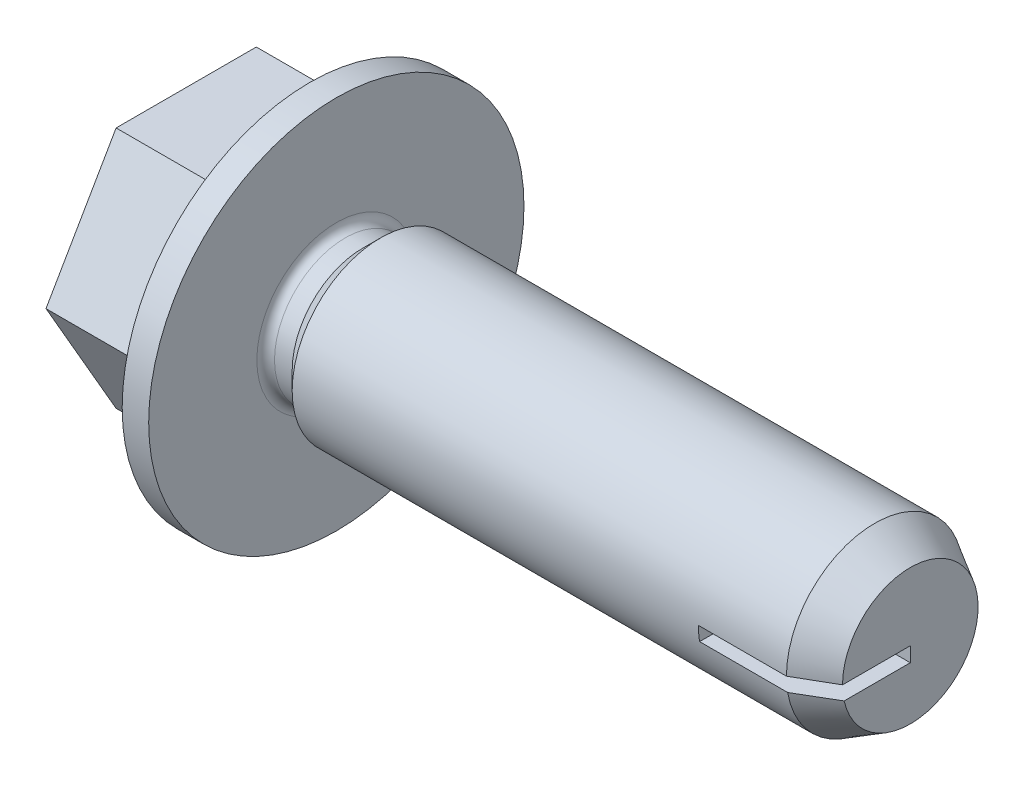
ISO-10303-21;
HEADER;
FILE_DESCRIPTION(('STEP AP214'),'2;1');
FILE_NAME('part.step','',(''),(''),'','','');
FILE_SCHEMA(('AUTOMOTIVE_DESIGN { 1 0 10303 214 1 1 1 1 }'));
ENDSEC;
DATA;
#1=APPLICATION_CONTEXT('core data for automotive mechanical design processes');
#2=APPLICATION_PROTOCOL_DEFINITION('international standard','automotive_design',2000,#1);
#3=PRODUCT_CONTEXT('',#1,'mechanical');
#4=PRODUCT('Part','Part','',(#3));
#5=PRODUCT_RELATED_PRODUCT_CATEGORY('part','',(#4));
#6=PRODUCT_DEFINITION_FORMATION('','',#4);
#7=PRODUCT_DEFINITION_CONTEXT('part definition',#1,'design');
#8=PRODUCT_DEFINITION('design','',#6,#7);
#9=PRODUCT_DEFINITION_SHAPE('','',#8);
#10=(LENGTH_UNIT() NAMED_UNIT(*) SI_UNIT(.MILLI.,.METRE.));
#11=(NAMED_UNIT(*) PLANE_ANGLE_UNIT() SI_UNIT($,.RADIAN.));
#12=(NAMED_UNIT(*) SI_UNIT($,.STERADIAN.) SOLID_ANGLE_UNIT());
#13=UNCERTAINTY_MEASURE_WITH_UNIT(LENGTH_MEASURE(1.E-05),#10,'distance_accuracy_value','');
#14=(GEOMETRIC_REPRESENTATION_CONTEXT(3) GLOBAL_UNCERTAINTY_ASSIGNED_CONTEXT((#13)) GLOBAL_UNIT_ASSIGNED_CONTEXT((#10,
#11,#12)) REPRESENTATION_CONTEXT('',''));
#15=CARTESIAN_POINT('',(0.,0.,0.));
#16=DIRECTION('',(0.,0.,1.));
#17=DIRECTION('',(1.,0.,0.));
#18=AXIS2_PLACEMENT_3D('',#15,#16,#17);
#19=CARTESIAN_POINT('',(-18.5110654105261,11.2461599689433,18.9159068269443));
#20=DIRECTION('',(-1.,0.,0.));
#21=DIRECTION('',(0.,0.,1.));
#22=AXIS2_PLACEMENT_3D('',#19,#20,#21);
#23=CYLINDRICAL_SURFACE('',#22,2.);
#24=CARTESIAN_POINT('',(-17.5110654105261,11.2461599689433,18.9159068269443));
#25=DIRECTION('',(-1.,0.,0.));
#26=DIRECTION('',(0.,0.,1.));
#27=AXIS2_PLACEMENT_3D('',#24,#25,#26);
#28=CIRCLE('',#27,2.);
#29=CARTESIAN_POINT('',(-17.5110654105261,11.2461599689433,20.9159068269443));
#30=VERTEX_POINT('',#29);
#31=EDGE_CURVE('E144',#30,#30,#28,.T.);
#32=ORIENTED_EDGE('',*,*,#31,.F.);
#33=EDGE_LOOP('',(#32));
#34=FACE_BOUND('',#33,.T.);
#35=DIRECTION('',(-1.,0.,0.));
#36=VECTOR('',#35,1.);
#37=CARTESIAN_POINT('',(-18.5110654105261,11.2461599689433,20.9159068269443));
#38=LINE('',#37,#36);
#39=CARTESIAN_POINT('',(-6.31646903604569,11.2461599689433,20.9159068269443));
#40=VERTEX_POINT('',#39);
#41=CARTESIAN_POINT('',(-8.31106541052615,11.2461599689433,20.9159068269443));
#42=VERTEX_POINT('',#41);
#43=EDGE_CURVE('E280',#40,#42,#38,.T.);
#44=ORIENTED_EDGE('',*,*,#43,.F.);
#45=CARTESIAN_POINT('',(-6.31646903604569,11.2461599689433,18.9159068269443));
#46=DIRECTION('',(-1.,0.,0.));
#47=DIRECTION('',(0.,0.,1.));
#48=AXIS2_PLACEMENT_3D('',#45,#46,#47);
#49=CIRCLE('',#48,2.);
#50=CARTESIAN_POINT('',(-6.31646903604569,10.9128266356099,20.8879334213108));
#51=VERTEX_POINT('',#50);
#52=EDGE_CURVE('E275',#40,#51,#49,.T.);
#53=ORIENTED_EDGE('',*,*,#52,.T.);
#54=DIRECTION('',(-1.,0.,0.));
#55=VECTOR('',#54,1.);
#56=CARTESIAN_POINT('',(-18.5110654105261,10.9128266356099,20.8879334213108));
#57=LINE('',#56,#55);
#58=CARTESIAN_POINT('',(-8.31106541052615,10.9128266356099,20.8879334213108));
#59=VERTEX_POINT('',#58);
#60=EDGE_CURVE('E284',#59,#51,#57,.F.);
#61=ORIENTED_EDGE('',*,*,#60,.F.);
#62=CARTESIAN_POINT('',(-8.31106541052615,11.2461599689433,18.9159068269443));
#63=DIRECTION('',(1.,0.,0.));
#64=DIRECTION('',(0.,0.,-1.));
#65=AXIS2_PLACEMENT_3D('',#62,#63,#64);
#66=CIRCLE('',#65,2.);
#67=EDGE_CURVE('E11',#42,#59,#66,.T.);
#68=ORIENTED_EDGE('',*,*,#67,.F.);
#69=EDGE_LOOP('',(#44,#53,#61,#68));
#70=FACE_BOUND('',#69,.T.);
#71=ADVANCED_FACE('F39',(#34,#70),#23,.T.);
#72=CARTESIAN_POINT('',(-6.31646903604569,11.2461599689433,18.9159068269443));
#73=DIRECTION('',(-1.,0.,0.));
#74=DIRECTION('',(0.,0.,1.));
#75=AXIS2_PLACEMENT_3D('',#72,#73,#74);
#76=CONICAL_SURFACE('',#75,2.,0.523598775598292);
#77=ORIENTED_EDGE('',*,*,#52,.F.);
#78=DIRECTION('',(-0.866025403784442,0.,0.499999999999994));
#79=VECTOR('',#78,1.);
#80=CARTESIAN_POINT('',(-2.85236742090788,11.2461599689433,18.9159068269443));
#81=LINE('',#80,#79);
#82=CARTESIAN_POINT('',(-5.51106541052615,11.2461599689433,20.4509068269443));
#83=VERTEX_POINT('',#82);
#84=EDGE_CURVE('E282',#40,#83,#81,.F.);
#85=ORIENTED_EDGE('',*,*,#84,.T.);
#86=CARTESIAN_POINT('',(-5.51106541052615,11.2461599689433,18.9159068269443));
#87=DIRECTION('',(-1.,0.,0.));
#88=DIRECTION('',(0.,0.,1.));
#89=AXIS2_PLACEMENT_3D('',#86,#87,#88);
#90=CIRCLE('',#89,1.535);
#91=CARTESIAN_POINT('',(-5.51106541052615,10.9128266356099,20.4142772380539));
#92=VERTEX_POINT('',#91);
#93=EDGE_CURVE('E142',#83,#92,#90,.T.);
#94=ORIENTED_EDGE('',*,*,#93,.T.);
#95=CARTESIAN_POINT('',(-3.78648882804793,10.9128266356099,19.3398759570878));
#96=CARTESIAN_POINT('',(-3.81069136481667,10.9128266356099,19.3576388068293));
#97=CARTESIAN_POINT('',(-3.83508285933429,10.9128266356099,19.3751394498348));
#98=CARTESIAN_POINT('',(-3.88415758422132,10.9128266356099,19.4097218575578));
#99=CARTESIAN_POINT('',(-3.90884078321983,10.9128266356099,19.4268036667213));
#100=CARTESIAN_POINT('',(-3.98319311802093,10.9128266356099,19.4775755480063));
#101=CARTESIAN_POINT('',(-4.03317815261506,10.9128266356099,19.5108015508022));
#102=CARTESIAN_POINT('',(-4.13363053775768,10.9128266356099,19.5764634573465));
#103=CARTESIAN_POINT('',(-4.18409767457642,10.9128266356099,19.6088996904746));
#104=CARTESIAN_POINT('',(-4.28537000984192,10.9128266356099,19.6732489099631));
#105=CARTESIAN_POINT('',(-4.33617523736049,10.9128266356099,19.7051618504874));
#106=CARTESIAN_POINT('',(-4.48310763650696,10.9128266356099,19.7967245206635));
#107=CARTESIAN_POINT('',(-4.57952469738359,10.9128266356099,19.8559081798036));
#108=CARTESIAN_POINT('',(-4.77280698618189,10.9128266356099,19.9735398575166));
#109=CARTESIAN_POINT('',(-4.86967222284825,10.9128266356099,20.0319878616521));
#110=CARTESIAN_POINT('',(-5.16074757735424,10.9128266356099,20.2066942403958));
#111=CARTESIAN_POINT('',(-5.35536619486831,10.9128266356099,20.3222713691282));
#112=CARTESIAN_POINT('',(-5.69927989954041,10.9128266356099,20.5255199612981));
#113=CARTESIAN_POINT('',(-5.84847360357287,10.9128266356099,20.6133638761978));
#114=CARTESIAN_POINT('',(-6.1470503145626,10.9128266356099,20.7887295925786));
#115=CARTESIAN_POINT('',(-6.29643332144133,10.9128266356099,20.8762513941934));
#116=CARTESIAN_POINT('',(-6.59521130206039,10.9128266356099,21.0510206745499));
#117=CARTESIAN_POINT('',(-6.74460618522668,10.9128266356099,21.1382683083116));
#118=CARTESIAN_POINT('',(-7.04348444487814,10.9128266356099,21.3126111771007));
#119=CARTESIAN_POINT('',(-7.19296782117817,10.9128266356099,21.3997064124453));
#120=CARTESIAN_POINT('',(-7.34247884182933,10.9128266356099,21.4867541087404));
#121=B_SPLINE_CURVE_WITH_KNOTS('',3,(#95,#96,#97,#98,#99,#100,#101,#102,#103,#104,#105,#106,
#107,#108,#109,#110,#111,#112,#113,#114,#115,#116,#117,#118,#119,#120),.UNSPECIFIED.,.F.,.F.,(4,
2,2,2,2,2,2,2,2,2,2,2,4),(0.,0.0900582312371445,0.180106863879655,0.360155492792022,
0.540127698161714,0.720115584310135,1.05950608853919,1.39890324302171,2.07794788471721,
2.59734938198935,3.11675066387128,3.63576777514392,4.15478380441623),.UNSPECIFIED.);
#122=EDGE_CURVE('E286',#92,#51,#121,.T.);
#123=ORIENTED_EDGE('',*,*,#122,.T.);
#124=EDGE_LOOP('',(#77,#85,#94,#123));
#125=FACE_BOUND('',#124,.T.);
#126=ADVANCED_FACE('F294',(#125),#76,.T.);
#127=CARTESIAN_POINT('',(-5.51106541052615,13.2461599689433,18.9159068269443));
#128=DIRECTION('',(-1.,0.,0.));
#129=DIRECTION('',(0.,0.,1.));
#130=AXIS2_PLACEMENT_3D('',#127,#128,#129);
#131=PLANE('',#130);
#132=DIRECTION('',(0.,0.,1.));
#133=VECTOR('',#132,1.);
#134=CARTESIAN_POINT('',(-5.51106541052615,11.2461599689433,18.9159068269443));
#135=LINE('',#134,#133);
#136=CARTESIAN_POINT('',(-5.51106541052615,11.2461599689433,18.9159068269443));
#137=VERTEX_POINT('',#136);
#138=EDGE_CURVE('E47',#137,#83,#135,.T.);
#139=ORIENTED_EDGE('',*,*,#138,.F.);
#140=DIRECTION('',(0.,1.,0.));
#141=VECTOR('',#140,1.);
#142=CARTESIAN_POINT('',(-5.51106541052615,11.2461599689433,18.9159068269443));
#143=LINE('',#142,#141);
#144=CARTESIAN_POINT('',(-5.51106541052615,10.9128266356099,18.9159068269443));
#145=VERTEX_POINT('',#144);
#146=EDGE_CURVE('E131',#145,#137,#143,.T.);
#147=ORIENTED_EDGE('',*,*,#146,.F.);
#148=DIRECTION('',(0.,0.,-1.));
#149=VECTOR('',#148,1.);
#150=CARTESIAN_POINT('',(-5.51106541052615,10.9128266356099,18.9159068269443));
#151=LINE('',#150,#149);
#152=EDGE_CURVE('E143',#92,#145,#151,.T.);
#153=ORIENTED_EDGE('',*,*,#152,.F.);
#154=ORIENTED_EDGE('',*,*,#93,.F.);
#155=EDGE_LOOP('',(#139,#147,#153,#154));
#156=FACE_BOUND('',#155,.T.);
#157=ADVANCED_FACE('F140',(#156),#131,.F.);
#158=CARTESIAN_POINT('',(-21.9110654105261,13.9961599689433,18.9159068269443));
#159=DIRECTION('',(1.,0.,0.));
#160=DIRECTION('',(0.,0.,-1.));
#161=AXIS2_PLACEMENT_3D('',#158,#159,#160);
#162=PLANE('',#161);
#163=CARTESIAN_POINT('',(-21.9110654105261,11.2461599689433,18.9159068269443));
#164=DIRECTION('',(-1.,0.,0.));
#165=DIRECTION('',(0.,0.,1.));
#166=AXIS2_PLACEMENT_3D('',#163,#164,#165);
#167=CIRCLE('',#166,2.2);
#168=CARTESIAN_POINT('',(-21.9110654105261,11.2461599689433,21.1159068269443));
#169=VERTEX_POINT('',#168);
#170=EDGE_CURVE('E334',#169,#169,#167,.T.);
#171=ORIENTED_EDGE('',*,*,#170,.F.);
#172=EDGE_LOOP('',(#171));
#173=FACE_BOUND('',#172,.T.);
#174=DIRECTION('',(0.,-0.866025403784439,-0.5));
#175=VECTOR('',#174,1.);
#176=CARTESIAN_POINT('',(-21.9110654105261,12.6211599689433,16.5343369665371));
#177=LINE('',#176,#175);
#178=CARTESIAN_POINT('',(-21.9110654105261,13.9961599689433,17.3281935866728));
#179=VERTEX_POINT('',#178);
#180=CARTESIAN_POINT('',(-21.9110654105261,11.2461599689433,15.7404803464013));
#181=VERTEX_POINT('',#180);
#182=EDGE_CURVE('E167',#179,#181,#177,.T.);
#183=ORIENTED_EDGE('',*,*,#182,.T.);
#184=DIRECTION('',(0.,-0.866025403784438,0.5));
#185=VECTOR('',#184,1.);
#186=CARTESIAN_POINT('',(-21.9110654105261,9.87115996894325,16.5343369665371));
#187=LINE('',#186,#185);
#188=CARTESIAN_POINT('',(-21.9110654105261,8.49615996894325,17.3281935866728));
#189=VERTEX_POINT('',#188);
#190=EDGE_CURVE('E241',#181,#189,#187,.T.);
#191=ORIENTED_EDGE('',*,*,#190,.T.);
#192=DIRECTION('',(0.,0.,1.));
#193=VECTOR('',#192,1.);
#194=CARTESIAN_POINT('',(-21.9110654105261,8.49615996894325,18.9159068269443));
#195=LINE('',#194,#193);
#196=CARTESIAN_POINT('',(-21.9110654105261,8.49615996894325,20.5036200672157));
#197=VERTEX_POINT('',#196);
#198=EDGE_CURVE('E270',#189,#197,#195,.T.);
#199=ORIENTED_EDGE('',*,*,#198,.T.);
#200=DIRECTION('',(0.,0.866025403784439,0.5));
#201=VECTOR('',#200,1.);
#202=CARTESIAN_POINT('',(-21.9110654105261,8.49615996894325,20.5036200672157));
#203=LINE('',#202,#201);
#204=CARTESIAN_POINT('',(-21.9110654105261,11.2461599689433,22.0913333074872));
#205=VERTEX_POINT('',#204);
#206=EDGE_CURVE('E239',#197,#205,#203,.T.);
#207=ORIENTED_EDGE('',*,*,#206,.T.);
#208=DIRECTION('',(0.,0.866025403784438,-0.5));
#209=VECTOR('',#208,1.);
#210=CARTESIAN_POINT('',(-21.9110654105261,11.2461599689433,22.0913333074872));
#211=LINE('',#210,#209);
#212=CARTESIAN_POINT('',(-21.9110654105261,13.9961599689433,20.5036200672157));
#213=VERTEX_POINT('',#212);
#214=EDGE_CURVE('E209',#205,#213,#211,.T.);
#215=ORIENTED_EDGE('',*,*,#214,.T.);
#216=DIRECTION('',(0.,0.,-1.));
#217=VECTOR('',#216,1.);
#218=CARTESIAN_POINT('',(-21.9110654105261,13.9961599689433,18.9159068269443));
#219=LINE('',#218,#217);
#220=EDGE_CURVE('E164',#213,#179,#219,.T.);
#221=ORIENTED_EDGE('',*,*,#220,.T.);
#222=EDGE_LOOP('',(#183,#191,#199,#207,#215,#221));
#223=FACE_BOUND('',#222,.T.);
#224=ADVANCED_FACE('F41',(#173,#223),#162,.F.);
#225=CARTESIAN_POINT('',(-17.5110654105261,11.2461599689433,18.9159068269443));
#226=DIRECTION('',(1.,0.,0.));
#227=DIRECTION('',(0.,0.,-1.));
#228=AXIS2_PLACEMENT_3D('',#225,#226,#227);
#229=CONICAL_SURFACE('',#228,2.,0.785398163397449);
#230=CARTESIAN_POINT('',(-17.9110654105261,11.2461599689433,18.9159068269443));
#231=DIRECTION('',(-1.,0.,0.));
#232=DIRECTION('',(0.,0.,1.));
#233=AXIS2_PLACEMENT_3D('',#230,#231,#232);
#234=CIRCLE('',#233,1.6);
#235=CARTESIAN_POINT('',(-17.9110654105261,11.2461599689433,20.5159068269443));
#236=VERTEX_POINT('',#235);
#237=EDGE_CURVE('E149',#236,#236,#234,.T.);
#238=ORIENTED_EDGE('',*,*,#237,.F.);
#239=EDGE_LOOP('',(#238));
#240=FACE_BOUND('',#239,.T.);
#241=ORIENTED_EDGE('',*,*,#31,.T.);
#242=EDGE_LOOP('',(#241));
#243=FACE_BOUND('',#242,.T.);
#244=ADVANCED_FACE('F320',(#240,#243),#229,.T.);
#245=CARTESIAN_POINT('',(-18.5110654105261,11.2461599689433,18.9159068269443));
#246=DIRECTION('',(-1.,0.,0.));
#247=DIRECTION('',(0.,0.,1.));
#248=AXIS2_PLACEMENT_3D('',#245,#246,#247);
#249=CYLINDRICAL_SURFACE('',#248,1.6);
#250=CARTESIAN_POINT('',(-18.3110654105261,11.2461599689433,18.9159068269443));
#251=DIRECTION('',(-1.,0.,0.));
#252=DIRECTION('',(0.,0.,1.));
#253=AXIS2_PLACEMENT_3D('',#250,#251,#252);
#254=CIRCLE('',#253,1.6);
#255=CARTESIAN_POINT('',(-18.3110654105261,11.2461599689433,20.5159068269443));
#256=VERTEX_POINT('',#255);
#257=EDGE_CURVE('E152',#256,#256,#254,.T.);
#258=ORIENTED_EDGE('',*,*,#257,.F.);
#259=EDGE_LOOP('',(#258));
#260=FACE_BOUND('',#259,.T.);
#261=ORIENTED_EDGE('',*,*,#237,.T.);
#262=EDGE_LOOP('',(#261));
#263=FACE_BOUND('',#262,.T.);
#264=ADVANCED_FACE('F330',(#260,#263),#249,.T.);
#265=CARTESIAN_POINT('',(-18.3110654105261,11.2461599689433,18.9159068269443));
#266=DIRECTION('',(-1.,0.,0.));
#267=DIRECTION('',(0.,0.,1.));
#268=AXIS2_PLACEMENT_3D('',#265,#266,#267);
#269=TOROIDAL_SURFACE('',#268,1.8,0.2);
#270=CARTESIAN_POINT('',(-18.5110654105261,11.2461599689433,18.9159068269443));
#271=DIRECTION('',(-1.,0.,0.));
#272=DIRECTION('',(0.,0.,1.));
#273=AXIS2_PLACEMENT_3D('',#270,#271,#272);
#274=CIRCLE('',#273,1.8);
#275=CARTESIAN_POINT('',(-18.5110654105261,11.2461599689433,20.7159068269443));
#276=VERTEX_POINT('',#275);
#277=EDGE_CURVE('E155',#276,#276,#274,.T.);
#278=ORIENTED_EDGE('',*,*,#277,.F.);
#279=EDGE_LOOP('',(#278));
#280=FACE_BOUND('',#279,.T.);
#281=ORIENTED_EDGE('',*,*,#257,.T.);
#282=EDGE_LOOP('',(#281));
#283=FACE_BOUND('',#282,.T.);
#284=ADVANCED_FACE('F452',(#280,#283),#269,.F.);
#285=CARTESIAN_POINT('',(-18.5110654105261,15.4961599689433,18.9159068269443));
#286=DIRECTION('',(-1.,0.,0.));
#287=DIRECTION('',(0.,0.,1.));
#288=AXIS2_PLACEMENT_3D('',#285,#286,#287);
#289=PLANE('',#288);
#290=CARTESIAN_POINT('',(-18.5110654105261,11.2461599689433,18.9159068269443));
#291=DIRECTION('',(-1.,0.,0.));
#292=DIRECTION('',(0.,0.,1.));
#293=AXIS2_PLACEMENT_3D('',#290,#291,#292);
#294=CIRCLE('',#293,4.25);
#295=CARTESIAN_POINT('',(-18.5110654105261,11.2461599689433,23.1659068269443));
#296=VERTEX_POINT('',#295);
#297=EDGE_CURVE('E158',#296,#296,#294,.T.);
#298=ORIENTED_EDGE('',*,*,#297,.F.);
#299=EDGE_LOOP('',(#298));
#300=FACE_BOUND('',#299,.T.);
#301=ORIENTED_EDGE('',*,*,#277,.T.);
#302=EDGE_LOOP('',(#301));
#303=FACE_BOUND('',#302,.T.);
#304=ADVANCED_FACE('F442',(#300,#303),#289,.F.);
#305=CARTESIAN_POINT('',(-18.5110654105261,11.2461599689433,18.9159068269443));
#306=DIRECTION('',(-1.,0.,0.));
#307=DIRECTION('',(0.,0.,1.));
#308=AXIS2_PLACEMENT_3D('',#305,#306,#307);
#309=CYLINDRICAL_SURFACE('',#308,4.25);
#310=CARTESIAN_POINT('',(-19.1110654105261,11.2461599689433,18.9159068269443));
#311=DIRECTION('',(-1.,0.,0.));
#312=DIRECTION('',(0.,0.,1.));
#313=AXIS2_PLACEMENT_3D('',#310,#311,#312);
#314=CIRCLE('',#313,4.25);
#315=CARTESIAN_POINT('',(-19.1110654105261,11.2461599689433,23.1659068269443));
#316=VERTEX_POINT('',#315);
#317=EDGE_CURVE('E161',#316,#316,#314,.T.);
#318=ORIENTED_EDGE('',*,*,#317,.F.);
#319=EDGE_LOOP('',(#318));
#320=FACE_BOUND('',#319,.T.);
#321=ORIENTED_EDGE('',*,*,#297,.T.);
#322=EDGE_LOOP('',(#321));
#323=FACE_BOUND('',#322,.T.);
#324=ADVANCED_FACE('F432',(#320,#323),#309,.T.);
#325=CARTESIAN_POINT('',(-19.1110654105261,11.2461599689433,18.9159068269443));
#326=DIRECTION('',(1.,0.,0.));
#327=DIRECTION('',(0.,0.,-1.));
#328=AXIS2_PLACEMENT_3D('',#325,#326,#327);
#329=CONICAL_SURFACE('',#328,4.25,1.25663706143592);
#330=CARTESIAN_POINT('',(-19.4601779915069,11.2463599689433,15.7403648763475));
#331=CARTESIAN_POINT('',(-19.4815777598813,11.1323366221652,15.8061962863037));
#332=CARTESIAN_POINT('',(-19.5010275929063,11.0180117354332,15.8722017904335));
#333=CARTESIAN_POINT('',(-19.5352265402297,10.7887689947879,16.0045551484549));
#334=CARTESIAN_POINT('',(-19.5499727776667,10.6738508214951,16.0709031867402));
#335=CARTESIAN_POINT('',(-19.5738450010227,10.4444414314945,16.2033527598117));
#336=CARTESIAN_POINT('',(-19.5830126306195,10.3299535543452,16.2694523665028));
#337=CARTESIAN_POINT('',(-19.5953099178513,10.100763752939,16.4017751600402));
#338=CARTESIAN_POINT('',(-19.5984413416374,9.98606190112467,16.4679983050617));
#339=CARTESIAN_POINT('',(-19.5984485628529,9.75662496818338,16.6004637800574));
#340=CARTESIAN_POINT('',(-19.5953225565243,9.6418898870101,16.6667061100583));
#341=CARTESIAN_POINT('',(-19.5830322245669,9.41263354938884,16.7990673182974));
#342=CARTESIAN_POINT('',(-19.5738661304725,9.29811236541842,16.8651861546906));
#343=CARTESIAN_POINT('',(-19.5499933742946,9.06863603963438,16.9976743731547));
#344=CARTESIAN_POINT('',(-19.5352450293891,8.95368423967468,17.0640418258052));
#345=CARTESIAN_POINT('',(-19.5010388951175,8.72437458447466,17.1964338169627));
#346=CARTESIAN_POINT('',(-19.4815839857854,8.61001640953033,17.2624585400509));
#347=CARTESIAN_POINT('',(-19.4601779915069,8.49595996894325,17.3283090567266));
#348=B_SPLINE_CURVE_WITH_KNOTS('',3,(#330,#331,#332,#333,#334,#335,#336,#337,#338,#339,#340,
#341,#342,#343,#344,#345,#346,#347),.UNSPECIFIED.,.F.,.F.,(4,2,2,2,2,2,2,2,4),(0.,
0.400203743713783,0.800651796865474,1.19807265735894,1.59537721766441,1.99279632091411,
2.3903318354586,2.79089627014001,3.19121620927126),.UNSPECIFIED.);
#349=CARTESIAN_POINT('',(-19.4602155120481,11.2461599689433,15.7404803464014));
#350=VERTEX_POINT('',#349);
#351=CARTESIAN_POINT('',(-19.4602155120488,8.49615996894325,17.3281935866728));
#352=VERTEX_POINT('',#351);
#353=EDGE_CURVE('E202',#350,#352,#348,.T.);
#354=ORIENTED_EDGE('',*,*,#353,.F.);
#355=CARTESIAN_POINT('',(-19.4601779915069,13.9963599689433,17.3283090567266));
#356=CARTESIAN_POINT('',(-19.4815839857854,13.8823035283562,17.2624585400509));
#357=CARTESIAN_POINT('',(-19.5010388951175,13.7679453534118,17.1964338169627));
#358=CARTESIAN_POINT('',(-19.5352450293891,13.5386356982118,17.0640418258052));
#359=CARTESIAN_POINT('',(-19.5499933742946,13.4236838982521,16.9976743731547));
#360=CARTESIAN_POINT('',(-19.5738661304725,13.1942075724681,16.8651861546906));
#361=CARTESIAN_POINT('',(-19.5830322245669,13.0796863884977,16.7990673182974));
#362=CARTESIAN_POINT('',(-19.5953225565243,12.8504300508764,16.6667061100583));
#363=CARTESIAN_POINT('',(-19.5984485628529,12.7356949697031,16.6004637800574));
#364=CARTESIAN_POINT('',(-19.5984413416374,12.5062580367618,16.4679983050617));
#365=CARTESIAN_POINT('',(-19.5953099178513,12.3915561849475,16.4017751600402));
#366=CARTESIAN_POINT('',(-19.5830126306195,12.1623663835413,16.2694523665028));
#367=CARTESIAN_POINT('',(-19.5738450010227,12.047878506392,16.2033527598117));
#368=CARTESIAN_POINT('',(-19.5499727776667,11.8184691163914,16.0709031867402));
#369=CARTESIAN_POINT('',(-19.5352265402297,11.7035509430986,16.0045551484549));
#370=CARTESIAN_POINT('',(-19.5010275929063,11.4743082024533,15.8722017904335));
#371=CARTESIAN_POINT('',(-19.4815777598813,11.3599833157213,15.8061962863037));
#372=CARTESIAN_POINT('',(-19.4601779915069,11.2459599689433,15.7403648763475));
#373=B_SPLINE_CURVE_WITH_KNOTS('',3,(#355,#356,#357,#358,#359,#360,#361,#362,#363,#364,#365,
#366,#367,#368,#369,#370,#371,#372),.UNSPECIFIED.,.F.,.F.,(4,2,2,2,2,2,2,2,4),(0.,
0.400319939131255,0.800884373812665,1.19841988835715,1.59583899160685,1.99314355191233,
2.39056441240579,2.79101246555749,3.19121620927126),.UNSPECIFIED.);
#374=CARTESIAN_POINT('',(-19.4602155120481,13.9961599689432,17.3281935866727));
#375=VERTEX_POINT('',#374);
#376=EDGE_CURVE('E62',#375,#350,#373,.T.);
#377=ORIENTED_EDGE('',*,*,#376,.F.);
#378=CARTESIAN_POINT('',(-17.8742874903059,13.9961599689433,26.4884400169122));
#379=CARTESIAN_POINT('',(-17.9459630474692,13.9961599689433,26.2536949106363));
#380=CARTESIAN_POINT('',(-18.0173126773193,13.9961599689433,26.0188491105857));
#381=CARTESIAN_POINT('',(-18.1590867106109,13.9961599689433,25.548865974912));
#382=CARTESIAN_POINT('',(-18.2295110682913,13.9961599689433,25.3137286254945));
#383=CARTESIAN_POINT('',(-18.3692771669736,13.9961599689433,24.8426804836776));
#384=CARTESIAN_POINT('',(-18.4386167803552,13.9961599689433,24.606769058548));
#385=CARTESIAN_POINT('',(-18.5756471079688,13.9961599689433,24.1344739536472));
#386=CARTESIAN_POINT('',(-18.6433378689558,13.9961599689433,23.8980902874732));
#387=CARTESIAN_POINT('',(-18.7771922895626,13.9961599689433,23.4219632725852));
#388=CARTESIAN_POINT('',(-18.8433295578799,13.9961599689433,23.1822124670792));
#389=CARTESIAN_POINT('',(-18.972226426885,13.9961599689433,22.7018071564611));
#390=CARTESIAN_POINT('',(-19.0349861206362,13.9961599689433,22.4611526764438));
#391=CARTESIAN_POINT('',(-19.1555010273069,13.9961599689433,21.9786183934307));
#392=CARTESIAN_POINT('',(-19.2132571239849,13.9961599689433,21.7367388148385));
#393=CARTESIAN_POINT('',(-19.2941538446212,13.9961599689433,21.3726568609638));
#394=CARTESIAN_POINT('',(-19.3201612162413,13.9961599689433,21.2510961526184));
#395=CARTESIAN_POINT('',(-19.3697914850473,13.9961599689433,21.0074900645081));
#396=CARTESIAN_POINT('',(-19.3934142676343,13.9961599689433,20.8854446617422));
#397=CARTESIAN_POINT('',(-19.4643555171031,13.9961599689433,20.493902580884));
#398=CARTESIAN_POINT('',(-19.5060710075977,13.9961599689433,20.2233022850689));
#399=CARTESIAN_POINT('',(-19.5527295333165,13.9961599689433,19.8157488666769));
#400=CARTESIAN_POINT('',(-19.5656269877486,13.9961599689433,19.6797032624792));
#401=CARTESIAN_POINT('',(-19.5853259967623,13.9961599689433,19.4071644210362));
#402=CARTESIAN_POINT('',(-19.592127846764,13.9961599689433,19.2706712058059));
#403=CARTESIAN_POINT('',(-19.5991296352499,13.9961599689433,18.9981597816851));
#404=CARTESIAN_POINT('',(-19.599360706217,13.9961599689433,18.8621423869681));
#405=CARTESIAN_POINT('',(-19.5932820204265,13.9961599689433,18.5902543393132));
#406=CARTESIAN_POINT('',(-19.5869721281008,13.9961599689433,18.4543836894753));
#407=CARTESIAN_POINT('',(-19.5682575892534,13.9961599689433,18.1829319794296));
#408=CARTESIAN_POINT('',(-19.5558466819779,13.9961599689433,18.0473513606944));
#409=CARTESIAN_POINT('',(-19.5257033430078,13.9961599689433,17.7767803272675));
#410=CARTESIAN_POINT('',(-19.5079703760282,13.9961599689433,17.64178997333));
#411=CARTESIAN_POINT('',(-19.4684425448045,13.9961599689433,17.3749591453759));
#412=CARTESIAN_POINT('',(-19.4467286331853,13.9961599689433,17.2431064971435));
#413=CARTESIAN_POINT('',(-19.399836320644,13.9961599689433,16.9800266336387));
#414=CARTESIAN_POINT('',(-19.3746579550855,13.9961599689433,16.8487994119964));
#415=CARTESIAN_POINT('',(-19.3215330732526,13.9961599689433,16.5869275430668));
#416=CARTESIAN_POINT('',(-19.2935868912841,13.9961599689433,16.4562828274097));
#417=CARTESIAN_POINT('',(-19.2354887417376,13.9961599689433,16.1954849295484));
#418=CARTESIAN_POINT('',(-19.2053367296048,13.9961599689433,16.0653317573286));
#419=CARTESIAN_POINT('',(-19.1429527816211,13.9961599689433,15.8040949105848));
#420=CARTESIAN_POINT('',(-19.1107024698182,13.9961599689433,15.6730156435286));
#421=CARTESIAN_POINT('',(-19.0447674344054,13.9961599689433,15.4112183237183));
#422=CARTESIAN_POINT('',(-19.0110826981233,13.9961599689433,15.2805002741662));
#423=CARTESIAN_POINT('',(-18.9425942108448,13.9961599689433,15.0194936581841));
#424=CARTESIAN_POINT('',(-18.9077915730904,13.9961599689433,14.8892047987282));
#425=CARTESIAN_POINT('',(-18.8372444025696,13.9961599689433,14.6288888123614));
#426=CARTESIAN_POINT('',(-18.8014999153074,13.9961599689433,14.4988616731314));
#427=CARTESIAN_POINT('',(-18.7653868167349,13.9961599689433,14.3689386418625));
#428=B_SPLINE_CURVE_WITH_KNOTS('',3,(#378,#379,#380,#381,#382,#383,#384,#385,#386,#387,#388,
#389,#390,#391,#392,#393,#394,#395,#396,#397,#398,#399,#400,#401,#402,#403,#404,#405,#406,#407,
#408,#409,#410,#411,#412,#413,#414,#415,#416,#417,#418,#419,#420,#421,#422,#423,#424,#425,#426,
#427),.UNSPECIFIED.,.F.,.F.,(4,2,2,2,2,2,2,2,2,2,2,2,2,2,2,2,2,2,2,2,2,2,2,2,4),(0.,
0.736332797616006,1.4727018759488,2.21036921514899,2.94801561260264,3.69411562584501,
4.44019507102768,5.18614247040058,5.55905285612401,5.9319811547209,6.75266052290387,
7.16251520202818,7.57235001669918,7.98024270060076,8.38814383865317,8.79646443420134,
9.20482611180911,9.60565574401611,10.0064812850372,10.4072584719475,10.8080437562775,
11.2129988593875,11.617957540788,12.0225247445917,12.4270724379738),.UNSPECIFIED.);
#429=CARTESIAN_POINT('',(-19.4602155120481,13.9961599689433,20.5036200672156));
#430=VERTEX_POINT('',#429);
#431=EDGE_CURVE('E177',#430,#375,#428,.T.);
#432=ORIENTED_EDGE('',*,*,#431,.F.);
#433=CARTESIAN_POINT('',(-19.4601779915069,11.2459599689433,22.0914487775411));
#434=CARTESIAN_POINT('',(-19.4815808728291,11.359999862621,22.0256078142279));
#435=CARTESIAN_POINT('',(-19.5010332440494,11.4743413934443,21.9595927006275));
#436=CARTESIAN_POINT('',(-19.535235785064,11.703617591331,21.8272200260588));
#437=CARTESIAN_POINT('',(-19.5499830764107,11.8185525779361,21.7608622806031));
#438=CARTESIAN_POINT('',(-19.5738555667015,12.0479954358049,21.6283933848489));
#439=CARTESIAN_POINT('',(-19.5830224288924,12.1624999663623,21.5622841633081));
#440=CARTESIAN_POINT('',(-19.5953162393253,12.3917230359009,21.4299421624055));
#441=CARTESIAN_POINT('',(-19.5984449548755,12.5064415024221,21.3637094248785));
#442=CARTESIAN_POINT('',(-19.5984449548755,12.7358784354644,21.2312439498245));
#443=CARTESIAN_POINT('',(-19.5953162393253,12.8505969019856,21.1650112122975));
#444=CARTESIAN_POINT('',(-19.5830224288924,13.0798199715242,21.0326692113948));
#445=CARTESIAN_POINT('',(-19.5738555667015,13.1943245020817,20.9665599898541));
#446=CARTESIAN_POINT('',(-19.5499830764107,13.4237673599504,20.8340910940999));
#447=CARTESIAN_POINT('',(-19.535235785064,13.5387023465555,20.7677333486441));
#448=CARTESIAN_POINT('',(-19.5010332440494,13.7679785444422,20.6353606740755));
#449=CARTESIAN_POINT('',(-19.4815808728291,13.8823200752655,20.5693455604751));
#450=CARTESIAN_POINT('',(-19.4601779915069,13.9963599689433,20.5035045971619));
#451=B_SPLINE_CURVE_WITH_KNOTS('',3,(#433,#434,#435,#436,#437,#438,#439,#440,#441,#442,#443,
#444,#445,#446,#447,#448,#449,#450),.UNSPECIFIED.,.F.,.F.,(4,2,2,2,2,2,2,2,4),(0.,
0.400261841398716,0.800768085295466,1.19824627283971,1.59560810464414,1.99296993644857,
2.3904481239928,2.79095436788956,3.19121620928827),.UNSPECIFIED.);
#452=CARTESIAN_POINT('',(-19.4602155120481,11.2461599689434,22.0913333074872));
#453=VERTEX_POINT('',#452);
#454=EDGE_CURVE('E194',#453,#430,#451,.T.);
#455=ORIENTED_EDGE('',*,*,#454,.F.);
#456=CARTESIAN_POINT('',(-19.4601779915069,8.49595996894325,20.5035045971619));
#457=CARTESIAN_POINT('',(-19.4815808728291,8.60999986262097,20.5693455604751));
#458=CARTESIAN_POINT('',(-19.5010332440494,8.72434139344428,20.6353606740755));
#459=CARTESIAN_POINT('',(-19.535235785064,8.95361759133097,20.7677333486441));
#460=CARTESIAN_POINT('',(-19.5499830764107,9.06855257793609,20.8340910940999));
#461=CARTESIAN_POINT('',(-19.5738555667015,9.29799543580486,20.9665599898541));
#462=CARTESIAN_POINT('',(-19.5830224288924,9.41249996636228,21.0326692113949));
#463=CARTESIAN_POINT('',(-19.5953162393253,9.64172303590093,21.1650112122975));
#464=CARTESIAN_POINT('',(-19.5984449548755,9.75644150242209,21.2312439498245));
#465=CARTESIAN_POINT('',(-19.5984449548755,9.98587843546441,21.3637094248785));
#466=CARTESIAN_POINT('',(-19.5953162393253,10.1005969019856,21.4299421624055));
#467=CARTESIAN_POINT('',(-19.5830224288924,10.3298199715242,21.5622841633081));
#468=CARTESIAN_POINT('',(-19.5738555667015,10.4443245020817,21.6283933848489));
#469=CARTESIAN_POINT('',(-19.5499830764107,10.6737673599504,21.7608622806031));
#470=CARTESIAN_POINT('',(-19.535235785064,10.7887023465555,21.8272200260588));
#471=CARTESIAN_POINT('',(-19.5010332440494,11.0179785444422,21.9595927006275));
#472=CARTESIAN_POINT('',(-19.4815808728291,11.1323200752655,22.0256078142279));
#473=CARTESIAN_POINT('',(-19.4601779915069,11.2463599689433,22.0914487775411));
#474=B_SPLINE_CURVE_WITH_KNOTS('',3,(#456,#457,#458,#459,#460,#461,#462,#463,#464,#465,#466,
#467,#468,#469,#470,#471,#472,#473),.UNSPECIFIED.,.F.,.F.,(4,2,2,2,2,2,2,2,4),(0.,
0.400261841398713,0.800768085295465,1.1982462728397,1.59560810464413,1.99296993644856,
2.3904481239928,2.79095436788955,3.19121620928827),.UNSPECIFIED.);
#475=CARTESIAN_POINT('',(-19.4602155120488,8.49615996894325,20.5036200672157));
#476=VERTEX_POINT('',#475);
#477=EDGE_CURVE('E232',#476,#453,#474,.T.);
#478=ORIENTED_EDGE('',*,*,#477,.F.);
#479=CARTESIAN_POINT('',(-18.7653868167349,8.49615996894325,14.3689386418625));
#480=CARTESIAN_POINT('',(-18.8011332244864,8.49615996894325,14.4975413886468));
#481=CARTESIAN_POINT('',(-18.8365181059475,8.49615996894325,14.6262461971946));
#482=CARTESIAN_POINT('',(-18.9063670186285,8.49615996894325,14.8839114625536));
#483=CARTESIAN_POINT('',(-18.9408310080053,8.49615996894325,15.0128719306964));
#484=CARTESIAN_POINT('',(-19.0086755505059,8.49615996894325,15.2712349604302));
#485=CARTESIAN_POINT('',(-19.0420548291605,8.49615996894325,15.4006378577148));
#486=CARTESIAN_POINT('',(-19.1074167186267,8.49615996894325,15.659795940792));
#487=CARTESIAN_POINT('',(-19.1393993400736,8.49615996894325,15.7895511238939));
#488=CARTESIAN_POINT('',(-19.2019322246027,8.49615996894325,16.0507742477811));
#489=CARTESIAN_POINT('',(-19.232465058292,8.49615996894325,16.1822463797636));
#490=CARTESIAN_POINT('',(-19.2912952097908,8.49615996894325,16.4456900395097));
#491=CARTESIAN_POINT('',(-19.3195925729654,8.49615996894325,16.5776615570821));
#492=CARTESIAN_POINT('',(-19.3733715604746,8.49615996894325,16.842176328463));
#493=CARTESIAN_POINT('',(-19.3988532959686,8.49615996894325,16.9747195594857));
#494=CARTESIAN_POINT('',(-19.4462899540243,8.49615996894325,17.2404436115309));
#495=CARTESIAN_POINT('',(-19.4682448462502,8.49615996894325,17.3736244380275));
#496=CARTESIAN_POINT('',(-19.5080721670575,8.49615996894325,17.6424772633842));
#497=CARTESIAN_POINT('',(-19.5258842921085,8.49615996894325,17.7781583316611));
#498=CARTESIAN_POINT('',(-19.5561268896684,8.49615996894325,18.0501162015465));
#499=CARTESIAN_POINT('',(-19.5685579130875,8.49615996894325,18.1863929407274));
#500=CARTESIAN_POINT('',(-19.5872469732388,8.49615996894325,18.4592914817633));
#501=CARTESIAN_POINT('',(-19.5935089421939,8.49615996894325,18.595913008089));
#502=CARTESIAN_POINT('',(-19.5994155164506,8.49615996894325,18.8692981532801));
#503=CARTESIAN_POINT('',(-19.5990603189398,8.49615996894325,19.0060617677899));
#504=CARTESIAN_POINT('',(-19.5917808067448,8.49615996894325,19.2786598861296));
#505=CARTESIAN_POINT('',(-19.5848925617555,8.49615996894325,19.4144953691841));
#506=CARTESIAN_POINT('',(-19.5650906753734,8.49615996894325,19.6857203390495));
#507=CARTESIAN_POINT('',(-19.5521765973144,8.49615996894325,19.8211097928226));
#508=CARTESIAN_POINT('',(-19.5055871196677,8.49615996894325,20.2264355492531));
#509=CARTESIAN_POINT('',(-19.4640660124216,8.49615996894325,20.4954879730814));
#510=CARTESIAN_POINT('',(-19.4150544348285,8.49615996894325,20.7660074288527));
#511=CARTESIAN_POINT('',(-19.414529050156,8.49615996894325,20.7689026227401));
#512=CARTESIAN_POINT('',(-19.369674671685,8.49615996894325,21.0156845321446));
#513=CARTESIAN_POINT('',(-19.3195909903846,8.49615996894325,21.2585348833034));
#514=CARTESIAN_POINT('',(-19.2118802134894,8.49615996894325,21.7425651782026));
#515=CARTESIAN_POINT('',(-19.1542511149878,8.49615996894325,21.983744660455));
#516=CARTESIAN_POINT('',(-19.033968529385,8.49615996894325,22.465103549817));
#517=CARTESIAN_POINT('',(-18.9713099341559,8.49615996894325,22.7052816727677));
#518=CARTESIAN_POINT('',(-18.8426452561815,8.49615996894325,23.1847035826846));
#519=CARTESIAN_POINT('',(-18.7766395378155,8.49615996894325,23.4239474683141));
#520=CARTESIAN_POINT('',(-18.642930010197,8.49615996894325,23.8995231395665));
#521=CARTESIAN_POINT('',(-18.5752480983817,8.49615996894325,24.1358611034542));
#522=CARTESIAN_POINT('',(-18.4382369399431,8.49615996894325,24.6080662940768));
#523=CARTESIAN_POINT('',(-18.3689076379694,8.49615996894325,24.8439335047055));
#524=CARTESIAN_POINT('',(-18.2292098783559,8.49615996894325,25.3147360522366));
#525=CARTESIAN_POINT('',(-18.158844353296,8.49615996894325,25.5496722611234));
#526=CARTESIAN_POINT('',(-18.017190149939,8.49615996894325,26.0192524960011));
#527=CARTESIAN_POINT('',(-17.9459015219431,8.49615996894325,26.2538965371553));
#528=CARTESIAN_POINT('',(-17.8742874903079,8.49615996894325,26.4884400169059));
#529=B_SPLINE_CURVE_WITH_KNOTS('',3,(#479,#480,#481,#482,#483,#484,#485,#486,#487,#488,#489,
#490,#491,#492,#493,#494,#495,#496,#497,#498,#499,#500,#501,#502,#503,#504,#505,#506,#507,#508,
#509,#510,#511,#512,#513,#514,#515,#516,#517,#518,#519,#520,#521,#522,#523,#524,#525,#526,#527,
#528),.UNSPECIFIED.,.F.,.F.,(4,2,2,2,2,2,2,2,2,2,2,2,2,2,2,2,2,2,2,2,2,2,2,2,4),(0.,
0.400436813296491,0.80089179061815,1.20180141244002,1.60270798084195,2.00760571416323,
2.41249522865291,2.81736875262042,3.22224575887424,3.63269144894073,4.04309510817272,
4.45323700202699,4.86336667391026,5.27124507481903,5.67915303751504,6.49509250873731,
6.50391996271011,7.24756917601997,7.99141619035817,8.73602847955943,9.48055988102656,
10.2180665852578,10.9555981040024,11.6913384668602,12.4270389054562),.UNSPECIFIED.);
#530=EDGE_CURVE('E264',#352,#476,#529,.T.);
#531=ORIENTED_EDGE('',*,*,#530,.F.);
#532=EDGE_LOOP('',(#354,#377,#432,#455,#478,#531));
#533=FACE_BOUND('',#532,.T.);
#534=ORIENTED_EDGE('',*,*,#317,.T.);
#535=EDGE_LOOP('',(#534));
#536=FACE_BOUND('',#535,.T.);
#537=ADVANCED_FACE('F229',(#533,#536),#329,.T.);
#538=CARTESIAN_POINT('',(499981.48893459,13.9961599689433,18.9159068269443));
#539=DIRECTION('',(0.,1.,0.));
#540=DIRECTION('',(0.,0.,1.));
#541=AXIS2_PLACEMENT_3D('',#538,#539,#540);
#542=PLANE('',#541);
#543=ORIENTED_EDGE('',*,*,#220,.F.);
#544=DIRECTION('',(-1.,0.,0.));
#545=VECTOR('',#544,1.);
#546=CARTESIAN_POINT('',(499981.48893459,13.9961599689433,20.5036200672157));
#547=LINE('',#546,#545);
#548=EDGE_CURVE('E201',#430,#213,#547,.T.);
#549=ORIENTED_EDGE('',*,*,#548,.F.);
#550=ORIENTED_EDGE('',*,*,#431,.T.);
#551=DIRECTION('',(-1.,0.,0.));
#552=VECTOR('',#551,1.);
#553=CARTESIAN_POINT('',(499981.48893459,13.9961599689433,17.3281935866728));
#554=LINE('',#553,#552);
#555=EDGE_CURVE('E165',#375,#179,#554,.T.);
#556=ORIENTED_EDGE('',*,*,#555,.T.);
#557=EDGE_LOOP('',(#543,#549,#550,#556));
#558=FACE_BOUND('',#557,.T.);
#559=ADVANCED_FACE('F216',(#558),#542,.T.);
#560=CARTESIAN_POINT('',(499981.48893459,12.6211599689433,16.5343369665371));
#561=DIRECTION('',(0.,0.5,-0.866025403784439));
#562=DIRECTION('',(0.,0.866025403784439,0.5));
#563=AXIS2_PLACEMENT_3D('',#560,#561,#562);
#564=PLANE('',#563);
#565=ORIENTED_EDGE('',*,*,#555,.F.);
#566=ORIENTED_EDGE('',*,*,#376,.T.);
#567=DIRECTION('',(-1.,0.,0.));
#568=VECTOR('',#567,1.);
#569=CARTESIAN_POINT('',(499981.48893459,11.2461599689433,15.7404803464013));
#570=LINE('',#569,#568);
#571=EDGE_CURVE('E220',#350,#181,#570,.T.);
#572=ORIENTED_EDGE('',*,*,#571,.T.);
#573=ORIENTED_EDGE('',*,*,#182,.F.);
#574=EDGE_LOOP('',(#565,#566,#572,#573));
#575=FACE_BOUND('',#574,.T.);
#576=ADVANCED_FACE('F183',(#575),#564,.T.);
#577=CARTESIAN_POINT('',(499981.48893459,11.2461599689433,22.0913333074872));
#578=DIRECTION('',(0.,0.5,0.866025403784439));
#579=DIRECTION('',(0.,-0.866025403784439,0.5));
#580=AXIS2_PLACEMENT_3D('',#577,#578,#579);
#581=PLANE('',#580);
#582=ORIENTED_EDGE('',*,*,#214,.F.);
#583=DIRECTION('',(-1.,0.,0.));
#584=VECTOR('',#583,1.);
#585=CARTESIAN_POINT('',(499981.48893459,11.2461599689433,22.0913333074872));
#586=LINE('',#585,#584);
#587=EDGE_CURVE('E226',#453,#205,#586,.T.);
#588=ORIENTED_EDGE('',*,*,#587,.F.);
#589=ORIENTED_EDGE('',*,*,#454,.T.);
#590=ORIENTED_EDGE('',*,*,#548,.T.);
#591=EDGE_LOOP('',(#582,#588,#589,#590));
#592=FACE_BOUND('',#591,.T.);
#593=ADVANCED_FACE('F190',(#592),#581,.T.);
#594=CARTESIAN_POINT('',(499981.48893459,8.49615996894325,18.9159068269443));
#595=DIRECTION('',(0.,-1.,0.));
#596=DIRECTION('',(0.,0.,-1.));
#597=AXIS2_PLACEMENT_3D('',#594,#595,#596);
#598=PLANE('',#597);
#599=DIRECTION('',(-1.,0.,0.));
#600=VECTOR('',#599,1.);
#601=CARTESIAN_POINT('',(499981.48893459,8.49615996894325,17.3281935866728));
#602=LINE('',#601,#600);
#603=EDGE_CURVE('E269',#352,#189,#602,.T.);
#604=ORIENTED_EDGE('',*,*,#603,.F.);
#605=ORIENTED_EDGE('',*,*,#530,.T.);
#606=DIRECTION('',(-1.,0.,0.));
#607=VECTOR('',#606,1.);
#608=CARTESIAN_POINT('',(499981.48893459,8.49615996894325,20.5036200672157));
#609=LINE('',#608,#607);
#610=EDGE_CURVE('E238',#476,#197,#609,.T.);
#611=ORIENTED_EDGE('',*,*,#610,.T.);
#612=ORIENTED_EDGE('',*,*,#198,.F.);
#613=EDGE_LOOP('',(#604,#605,#611,#612));
#614=FACE_BOUND('',#613,.T.);
#615=ADVANCED_FACE('F258',(#614),#598,.T.);
#616=CARTESIAN_POINT('',(499981.48893459,9.87115996894325,16.5343369665371));
#617=DIRECTION('',(0.,-0.5,-0.866025403784438));
#618=DIRECTION('',(0.,0.866025403784439,-0.5));
#619=AXIS2_PLACEMENT_3D('',#616,#617,#618);
#620=PLANE('',#619);
#621=ORIENTED_EDGE('',*,*,#190,.F.);
#622=ORIENTED_EDGE('',*,*,#571,.F.);
#623=ORIENTED_EDGE('',*,*,#353,.T.);
#624=ORIENTED_EDGE('',*,*,#603,.T.);
#625=EDGE_LOOP('',(#621,#622,#623,#624));
#626=FACE_BOUND('',#625,.T.);
#627=ADVANCED_FACE('F254',(#626),#620,.T.);
#628=CARTESIAN_POINT('',(499981.48893459,8.49615996894325,20.5036200672157));
#629=DIRECTION('',(0.,-0.5,0.866025403784439));
#630=DIRECTION('',(0.,-0.866025403784439,-0.5));
#631=AXIS2_PLACEMENT_3D('',#628,#629,#630);
#632=PLANE('',#631);
#633=ORIENTED_EDGE('',*,*,#477,.T.);
#634=ORIENTED_EDGE('',*,*,#587,.T.);
#635=ORIENTED_EDGE('',*,*,#206,.F.);
#636=ORIENTED_EDGE('',*,*,#610,.F.);
#637=EDGE_LOOP('',(#633,#634,#635,#636));
#638=FACE_BOUND('',#637,.T.);
#639=ADVANCED_FACE('F235',(#638),#632,.T.);
#640=CARTESIAN_POINT('',(-8.31106541052615,11.2461599689433,23.1659068269443));
#641=DIRECTION('',(1.,0.,0.));
#642=DIRECTION('',(0.,0.,-1.));
#643=AXIS2_PLACEMENT_3D('',#640,#641,#642);
#644=PLANE('',#643);
#645=ORIENTED_EDGE('',*,*,#67,.T.);
#646=DIRECTION('',(0.,0.,-1.));
#647=VECTOR('',#646,1.);
#648=CARTESIAN_POINT('',(-8.31106541052615,10.9128266356099,23.1659068269443));
#649=LINE('',#648,#647);
#650=CARTESIAN_POINT('',(-8.31106541052615,10.9128266356099,18.9159068269443));
#651=VERTEX_POINT('',#650);
#652=EDGE_CURVE('E341',#59,#651,#649,.T.);
#653=ORIENTED_EDGE('',*,*,#652,.T.);
#654=DIRECTION('',(0.,-1.,0.));
#655=VECTOR('',#654,1.);
#656=CARTESIAN_POINT('',(-8.31106541052615,11.2461599689433,18.9159068269443));
#657=LINE('',#656,#655);
#658=CARTESIAN_POINT('',(-8.31106541052615,11.2461599689433,18.9159068269443));
#659=VERTEX_POINT('',#658);
#660=EDGE_CURVE('E130',#659,#651,#657,.T.);
#661=ORIENTED_EDGE('',*,*,#660,.F.);
#662=DIRECTION('',(0.,0.,-1.));
#663=VECTOR('',#662,1.);
#664=CARTESIAN_POINT('',(-8.31106541052615,11.2461599689433,23.1659068269443));
#665=LINE('',#664,#663);
#666=EDGE_CURVE('E128',#42,#659,#665,.T.);
#667=ORIENTED_EDGE('',*,*,#666,.F.);
#668=EDGE_LOOP('',(#645,#653,#661,#667));
#669=FACE_BOUND('',#668,.T.);
#670=ADVANCED_FACE('F304',(#669),#644,.T.);
#671=CARTESIAN_POINT('',(-5.51106541052615,11.2461599689433,23.1659068269443));
#672=DIRECTION('',(0.,-1.,0.));
#673=DIRECTION('',(1.,0.,0.));
#674=AXIS2_PLACEMENT_3D('',#671,#672,#673);
#675=PLANE('',#674);
#676=ORIENTED_EDGE('',*,*,#43,.T.);
#677=ORIENTED_EDGE('',*,*,#666,.T.);
#678=DIRECTION('',(-1.,0.,0.));
#679=VECTOR('',#678,1.);
#680=CARTESIAN_POINT('',(-5.51106541052615,11.2461599689433,18.9159068269443));
#681=LINE('',#680,#679);
#682=EDGE_CURVE('E123',#137,#659,#681,.T.);
#683=ORIENTED_EDGE('',*,*,#682,.F.);
#684=ORIENTED_EDGE('',*,*,#138,.T.);
#685=ORIENTED_EDGE('',*,*,#84,.F.);
#686=EDGE_LOOP('',(#676,#677,#683,#684,#685));
#687=FACE_BOUND('',#686,.T.);
#688=ADVANCED_FACE('F124',(#687),#675,.T.);
#689=CARTESIAN_POINT('',(-5.51106541052615,10.9128266356099,23.1659068269443));
#690=DIRECTION('',(0.,1.,0.));
#691=DIRECTION('',(-1.,0.,0.));
#692=AXIS2_PLACEMENT_3D('',#689,#690,#691);
#693=PLANE('',#692);
#694=ORIENTED_EDGE('',*,*,#60,.T.);
#695=ORIENTED_EDGE('',*,*,#122,.F.);
#696=ORIENTED_EDGE('',*,*,#152,.T.);
#697=DIRECTION('',(1.,0.,0.));
#698=VECTOR('',#697,1.);
#699=CARTESIAN_POINT('',(-5.51106541052615,10.9128266356099,18.9159068269443));
#700=LINE('',#699,#698);
#701=EDGE_CURVE('E54',#651,#145,#700,.T.);
#702=ORIENTED_EDGE('',*,*,#701,.F.);
#703=ORIENTED_EDGE('',*,*,#652,.F.);
#704=EDGE_LOOP('',(#694,#695,#696,#702,#703));
#705=FACE_BOUND('',#704,.T.);
#706=ADVANCED_FACE('F297',(#705),#693,.T.);
#707=CARTESIAN_POINT('',(-5.51106541052615,11.2461599689433,18.9159068269443));
#708=DIRECTION('',(0.,0.,-1.));
#709=DIRECTION('',(-1.,0.,0.));
#710=AXIS2_PLACEMENT_3D('',#707,#708,#709);
#711=PLANE('',#710);
#712=ORIENTED_EDGE('',*,*,#146,.T.);
#713=ORIENTED_EDGE('',*,*,#682,.T.);
#714=ORIENTED_EDGE('',*,*,#660,.T.);
#715=ORIENTED_EDGE('',*,*,#701,.T.);
#716=EDGE_LOOP('',(#712,#713,#714,#715));
#717=FACE_BOUND('',#716,.T.);
#718=ADVANCED_FACE('F134',(#717),#711,.F.);
#719=CARTESIAN_POINT('',(-21.3510654105261,11.2461599689433,18.9159068269443));
#720=DIRECTION('',(-1.,0.,0.));
#721=DIRECTION('',(0.,0.,1.));
#722=AXIS2_PLACEMENT_3D('',#719,#720,#721);
#723=CYLINDRICAL_SURFACE('',#722,2.2);
#724=CARTESIAN_POINT('',(-21.3510654105261,11.2461599689433,18.9159068269443));
#725=DIRECTION('',(-1.,0.,0.));
#726=DIRECTION('',(0.,0.,1.));
#727=AXIS2_PLACEMENT_3D('',#724,#725,#726);
#728=CIRCLE('',#727,2.2);
#729=CARTESIAN_POINT('',(-21.3510654105261,11.2461599689433,21.1159068269443));
#730=VERTEX_POINT('',#729);
#731=EDGE_CURVE('E137',#730,#730,#728,.T.);
#732=ORIENTED_EDGE('',*,*,#731,.F.);
#733=EDGE_LOOP('',(#732));
#734=FACE_BOUND('',#733,.T.);
#735=ORIENTED_EDGE('',*,*,#170,.T.);
#736=EDGE_LOOP('',(#735));
#737=FACE_BOUND('',#736,.T.);
#738=ADVANCED_FACE('F351',(#734,#737),#723,.F.);
#739=CARTESIAN_POINT('',(-21.3510654105261,11.2461599689433,18.9159068269443));
#740=DIRECTION('',(-1.,0.,0.));
#741=DIRECTION('',(0.,0.,1.));
#742=AXIS2_PLACEMENT_3D('',#739,#740,#741);
#743=PLANE('',#742);
#744=ORIENTED_EDGE('',*,*,#731,.T.);
#745=EDGE_LOOP('',(#744));
#746=FACE_BOUND('',#745,.T.);
#747=ADVANCED_FACE('F349',(#746),#743,.T.);
#748=CLOSED_SHELL('',(#71,#126,#157,#224,#244,#264,#284,#304,#324,#537,#559,#576,#593,#615,#627,
#639,#670,#688,#706,#718,#738,#747));
#749=MANIFOLD_SOLID_BREP('B2',#748);
#750=ADVANCED_BREP_SHAPE_REPRESENTATION('',(#18,#749),#14);
#751=SHAPE_DEFINITION_REPRESENTATION(#9,#750);
ENDSEC;
END-ISO-10303-21;
